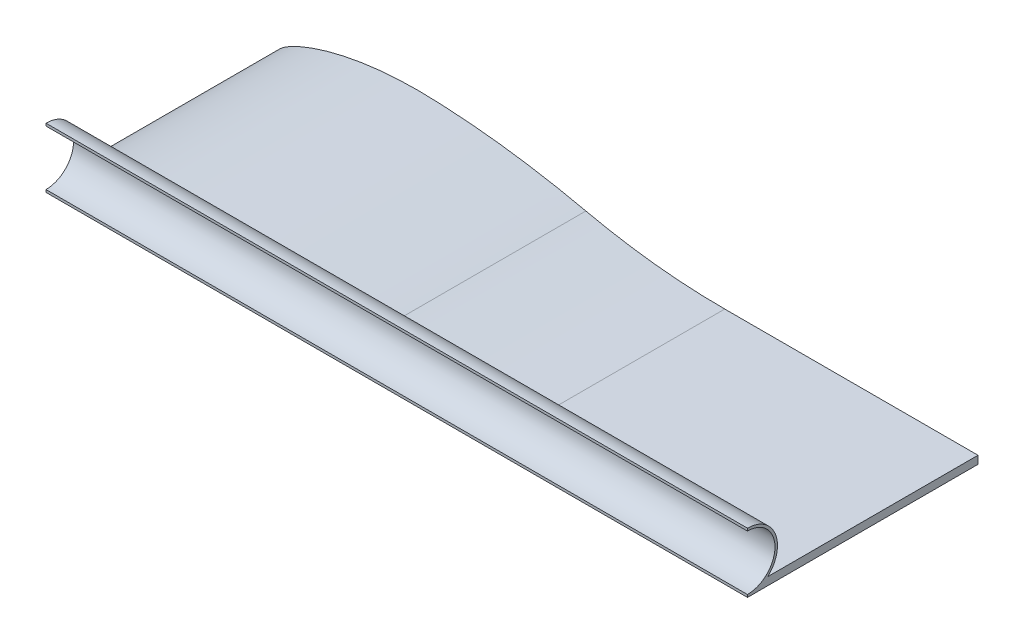
ISO-10303-21;
HEADER;
FILE_DESCRIPTION(('STEP AP214'),'2;1');
FILE_NAME('part.step','',(''),(''),'','','');
FILE_SCHEMA(('AUTOMOTIVE_DESIGN { 1 0 10303 214 1 1 1 1 }'));
ENDSEC;
DATA;
#1=APPLICATION_CONTEXT('core data for automotive mechanical design processes');
#2=APPLICATION_PROTOCOL_DEFINITION('international standard','automotive_design',2000,#1);
#3=PRODUCT_CONTEXT('',#1,'mechanical');
#4=PRODUCT('Part','Part','',(#3));
#5=PRODUCT_RELATED_PRODUCT_CATEGORY('part','',(#4));
#6=PRODUCT_DEFINITION_FORMATION('','',#4);
#7=PRODUCT_DEFINITION_CONTEXT('part definition',#1,'design');
#8=PRODUCT_DEFINITION('design','',#6,#7);
#9=PRODUCT_DEFINITION_SHAPE('','',#8);
#10=(LENGTH_UNIT() NAMED_UNIT(*) SI_UNIT(.MILLI.,.METRE.));
#11=(NAMED_UNIT(*) PLANE_ANGLE_UNIT() SI_UNIT($,.RADIAN.));
#12=(NAMED_UNIT(*) SI_UNIT($,.STERADIAN.) SOLID_ANGLE_UNIT());
#13=UNCERTAINTY_MEASURE_WITH_UNIT(LENGTH_MEASURE(1.E-05),#10,'distance_accuracy_value','');
#14=(GEOMETRIC_REPRESENTATION_CONTEXT(3) GLOBAL_UNCERTAINTY_ASSIGNED_CONTEXT((#13)) GLOBAL_UNIT_ASSIGNED_CONTEXT((#10,
#11,#12)) REPRESENTATION_CONTEXT('',''));
#15=CARTESIAN_POINT('',(0.,0.,0.));
#16=DIRECTION('',(0.,0.,1.));
#17=DIRECTION('',(1.,0.,0.));
#18=AXIS2_PLACEMENT_3D('',#15,#16,#17);
#19=CARTESIAN_POINT('',(0.,0.,185.42));
#20=DIRECTION('',(0.,0.,1.));
#21=DIRECTION('',(1.,0.,0.));
#22=AXIS2_PLACEMENT_3D('',#19,#20,#21);
#23=PLANE('',#22);
#24=DIRECTION('',(-1.,0.,0.));
#25=VECTOR('',#24,1.);
#26=CARTESIAN_POINT('',(563.88,42.5733533691905,185.42));
#27=LINE('',#26,#25);
#28=CARTESIAN_POINT('',(563.88,42.5733533691905,185.42));
#29=VERTEX_POINT('',#28);
#30=CARTESIAN_POINT('',(-0.366692026212409,42.5733533691905,185.42));
#31=VERTEX_POINT('',#30);
#32=EDGE_CURVE('E52',#29,#31,#27,.T.);
#33=ORIENTED_EDGE('',*,*,#32,.F.);
#34=DIRECTION('',(0.,1.,0.));
#35=VECTOR('',#34,1.);
#36=CARTESIAN_POINT('',(563.88,0.,185.42));
#37=LINE('',#36,#35);
#38=CARTESIAN_POINT('',(563.88,44.6053533691905,185.42));
#39=VERTEX_POINT('',#38);
#40=EDGE_CURVE('E175',#29,#39,#37,.T.);
#41=ORIENTED_EDGE('',*,*,#40,.T.);
#42=DIRECTION('',(-1.,0.,0.));
#43=VECTOR('',#42,1.);
#44=CARTESIAN_POINT('',(563.88,44.6053533691905,185.42));
#45=LINE('',#44,#43);
#46=CARTESIAN_POINT('',(-0.366692026212367,44.6053533691905,185.42));
#47=VERTEX_POINT('',#46);
#48=EDGE_CURVE('E211',#39,#47,#45,.T.);
#49=ORIENTED_EDGE('',*,*,#48,.T.);
#50=DIRECTION('',(0.,1.,0.));
#51=VECTOR('',#50,1.);
#52=CARTESIAN_POINT('',(-0.366692026212367,0.,185.42));
#53=LINE('',#52,#51);
#54=EDGE_CURVE('E222',#31,#47,#53,.T.);
#55=ORIENTED_EDGE('',*,*,#54,.F.);
#56=EDGE_LOOP('',(#33,#41,#49,#55));
#57=FACE_BOUND('',#56,.T.);
#58=ADVANCED_FACE('F36',(#57),#23,.T.);
#59=CARTESIAN_POINT('',(0.,2.69535336919036,185.42));
#60=DIRECTION('',(0.,-1.,0.));
#61=DIRECTION('',(1.,0.,0.));
#62=AXIS2_PLACEMENT_3D('',#59,#60,#61);
#63=PLANE('',#62);
#64=DIRECTION('',(-1.,0.,0.));
#65=VECTOR('',#64,1.);
#66=CARTESIAN_POINT('',(563.88,2.69535336919068,169.106554625095));
#67=LINE('',#66,#65);
#68=CARTESIAN_POINT('',(563.88,2.69535336919068,169.106554625095));
#69=VERTEX_POINT('',#68);
#70=CARTESIAN_POINT('',(360.180421151928,2.69535336919056,169.106554625095));
#71=VERTEX_POINT('',#70);
#72=EDGE_CURVE('E60',#69,#71,#67,.T.);
#73=ORIENTED_EDGE('',*,*,#72,.F.);
#74=DIRECTION('',(0.,0.,-1.));
#75=VECTOR('',#74,1.);
#76=CARTESIAN_POINT('',(563.88,2.69535336919067,185.42));
#77=LINE('',#76,#75);
#78=CARTESIAN_POINT('',(563.88,2.69535336919067,0.));
#79=VERTEX_POINT('',#78);
#80=EDGE_CURVE('E121',#69,#79,#77,.T.);
#81=ORIENTED_EDGE('',*,*,#80,.T.);
#82=DIRECTION('',(-1.,0.,0.));
#83=VECTOR('',#82,1.);
#84=CARTESIAN_POINT('',(0.,2.69535336919036,0.));
#85=LINE('',#84,#83);
#86=CARTESIAN_POINT('',(360.180421151928,2.69535336919056,0.));
#87=VERTEX_POINT('',#86);
#88=EDGE_CURVE('E113',#79,#87,#85,.T.);
#89=ORIENTED_EDGE('',*,*,#88,.T.);
#90=DIRECTION('',(0.,0.,1.));
#91=VECTOR('',#90,1.);
#92=CARTESIAN_POINT('',(360.180421151928,2.69535336919056,185.42));
#93=LINE('',#92,#91);
#94=EDGE_CURVE('E118',#87,#71,#93,.T.);
#95=ORIENTED_EDGE('',*,*,#94,.T.);
#96=EDGE_LOOP('',(#73,#81,#89,#95));
#97=FACE_BOUND('',#96,.T.);
#98=ADVANCED_FACE('F120',(#97),#63,.F.);
#99=CARTESIAN_POINT('',(304.8,0.,185.42));
#100=CARTESIAN_POINT('',(304.806765113415,0.0297936907438,185.42));
#101=CARTESIAN_POINT('',(303.042265442166,0.505757681104882,185.42));
#102=CARTESIAN_POINT('',(301.260699107524,1.13128828679422,185.42));
#103=CARTESIAN_POINT('',(296.859481645383,2.43138214292342,185.42));
#104=CARTESIAN_POINT('',(291.428347563501,4.05950750692163,185.42));
#105=CARTESIAN_POINT('',(284.271481229636,6.10623828707882,185.42));
#106=CARTESIAN_POINT('',(275.759062516084,8.44101190552645,185.42));
#107=CARTESIAN_POINT('',(265.867595029522,11.0139121726236,185.42));
#108=CARTESIAN_POINT('',(254.72828410266,13.7239516275996,185.42));
#109=CARTESIAN_POINT('',(242.45219776627,16.501342019607,185.42));
#110=CARTESIAN_POINT('',(229.161916522714,19.2494538440017,185.42));
#111=CARTESIAN_POINT('',(215.002240334106,21.8918598082205,185.42));
#112=CARTESIAN_POINT('',(200.122077246214,24.3476644337164,185.42));
#113=CARTESIAN_POINT('',(184.681833301631,26.5449418917091,185.42));
#114=CARTESIAN_POINT('',(168.851714947921,28.4233907056108,185.42));
#115=CARTESIAN_POINT('',(152.808183208541,29.930661937332,185.42));
#116=CARTESIAN_POINT('',(136.726583628561,31.0048710051825,185.42));
#117=CARTESIAN_POINT('',(120.705050439528,31.6889083800929,185.42));
#118=CARTESIAN_POINT('',(104.91367571592,31.6961733177902,185.42));
#119=CARTESIAN_POINT('',(89.5648924045714,30.8862286831657,185.42));
#120=CARTESIAN_POINT('',(74.9378034426248,29.3709102924395,185.42));
#121=CARTESIAN_POINT('',(61.2207309550213,27.2233169079844,185.42));
#122=CARTESIAN_POINT('',(48.5867513337238,24.5540455106148,185.42));
#123=CARTESIAN_POINT('',(37.1861333906392,21.5011014723962,185.42));
#124=CARTESIAN_POINT('',(27.1552746614983,18.1970778873359,185.42));
#125=CARTESIAN_POINT('',(18.5969283006425,14.8044671458805,185.42));
#126=CARTESIAN_POINT('',(11.6063717286755,11.4360388322654,185.42));
#127=CARTESIAN_POINT('',(6.20537461581932,8.26316028915888,185.42));
#128=CARTESIAN_POINT('',(2.4620711553724,5.3102193566351,185.42));
#129=CARTESIAN_POINT('',(0.172825892274397,2.71807809904705,185.42));
#130=CARTESIAN_POINT('',(-0.366692026212387,-0.106725709936372,185.42));
#131=CARTESIAN_POINT('',(1.61853864418734,-2.17519153343636,185.42));
#132=CARTESIAN_POINT('',(4.90312913802598,-3.1117877974165,185.42));
#133=CARTESIAN_POINT('',(9.54050066961738,-3.65904451106276,185.42));
#134=CARTESIAN_POINT('',(15.6223250235567,-3.68468011379504,185.42));
#135=CARTESIAN_POINT('',(23.0877165309997,-3.30949507157914,185.42));
#136=CARTESIAN_POINT('',(31.8617424793389,-2.56072504363965,185.42));
#137=CARTESIAN_POINT('',(41.8437098749915,-1.53618962834286,185.42));
#138=CARTESIAN_POINT('',(52.9319861205823,-0.324549042889645,185.42));
#139=CARTESIAN_POINT('',(65.0085126482625,0.982737612858198,185.42));
#140=CARTESIAN_POINT('',(77.9641225568185,2.27751163277432,185.42));
#141=CARTESIAN_POINT('',(91.6740314858693,3.44660128053989,185.42));
#142=CARTESIAN_POINT('',(106.020407657375,4.41212483885966,185.42));
#143=CARTESIAN_POINT('',(120.95534562256,5.05177624345621,185.42));
#144=CARTESIAN_POINT('',(136.33914130998,5.41029723383236,185.42));
#145=CARTESIAN_POINT('',(152.007716340095,5.72933017095042,185.42));
#146=CARTESIAN_POINT('',(167.715786189237,5.89135553497832,185.42));
#147=CARTESIAN_POINT('',(183.286749282816,5.90781947795733,185.42));
#148=CARTESIAN_POINT('',(198.553027184666,5.75950083301546,185.42));
#149=CARTESIAN_POINT('',(213.347799024157,5.45737661505621,185.42));
#150=CARTESIAN_POINT('',(227.508384673819,5.01338248731081,185.42));
#151=CARTESIAN_POINT('',(240.877077650288,4.45854649480439,185.42));
#152=CARTESIAN_POINT('',(253.302348041566,3.81956254234677,185.42));
#153=CARTESIAN_POINT('',(264.636493620716,3.14064435260617,185.42));
#154=CARTESIAN_POINT('',(274.759317931257,2.45167335072776,185.42));
#155=CARTESIAN_POINT('',(283.511762664263,1.80333800911344,185.42));
#156=CARTESIAN_POINT('',(290.902443864489,1.20739442477992,185.42));
#157=CARTESIAN_POINT('',(296.536660630331,0.742433739926797,185.42));
#158=CARTESIAN_POINT('',(301.097723541562,0.310240549260641,185.42));
#159=CARTESIAN_POINT('',(302.984341567181,0.206591885939164,185.42));
#160=CARTESIAN_POINT('',(304.793276654245,-0.0296097451566188,185.42));
#161=CARTESIAN_POINT('',(304.8,0.,185.42));
#162=B_SPLINE_CURVE_WITH_KNOTS('',3,(#99,#100,#101,#102,#103,#104,#105,#106,#107,#108,#109,#110,
#111,#112,#113,#114,#115,#116,#117,#118,#119,#120,#121,#122,#123,#124,#125,#126,#127,#128,#129,
#130,#131,#132,#133,#134,#135,#136,#137,#138,#139,#140,#141,#142,#143,#144,#145,#146,#147,#148,
#149,#150,#151,#152,#153,#154,#155,#156,#157,#158,#159,#160,#161),.UNSPECIFIED.,.T.,.F.,(4,1,1,
1,1,1,1,1,1,1,1,1,1,1,1,1,1,1,1,1,1,1,1,1,1,1,1,1,1,1,1,1,1,1,1,1,1,1,1,1,1,1,1,1,1,1,1,1,1,1,1,
1,1,1,1,1,1,1,1,1,4),(0.,0.00137455348322331,0.00548449728179396,0.0122733609908927,
0.021682195504866,0.0335806119079948,0.0478307427867091,0.0643059527211734,0.082777332043007,
0.103063756455997,0.124929016786915,0.148149110667858,0.172444694611559,0.197572105868171,
0.223268880537162,0.249227774933554,0.275186209349679,0.300900708934774,0.326462938278696,
0.351222485186767,0.374905858971967,0.397269706218861,0.418072413969665,0.437079533175026,
0.454093093767394,0.468919631578705,0.48139171235289,0.491447126518173,0.499023571234557,
0.504293734329401,0.507921918342,0.511539686153778,0.516780527527172,0.524216490268905,
0.533991629403711,0.546033957270731,0.560220284382465,0.576403357410148,0.594370816485922,
0.613951103581465,0.634916884969972,0.657088503485648,0.680229909573905,0.704175481107386,
0.72909036740664,0.754353775526935,0.779667752347888,0.804760119952374,0.829359338708984,
0.853208710008459,0.876041363199166,0.897604065496152,0.917662212410958,0.935969860405553,
0.952309787739252,0.966502759006892,0.978350082728452,0.987731492337842,0.994510920242662,
0.998633932979557,1.),.UNSPECIFIED.);
#163=DIRECTION('',(0.,0.,-1.));
#164=VECTOR('',#163,1.);
#165=SURFACE_OF_LINEAR_EXTRUSION('',#162,#164);
#166=CARTESIAN_POINT('',(248.468052168918,15.1306788652424,161.889352868082));
#167=CARTESIAN_POINT('',(247.164925425588,15.4244599020673,161.822640183714));
#168=CARTESIAN_POINT('',(245.860667643667,15.7146705661414,161.762492399588));
#169=CARTESIAN_POINT('',(243.250371487808,16.2877798033205,161.654345455011));
#170=CARTESIAN_POINT('',(241.944333617626,16.570680118452,161.606343375866));
#171=CARTESIAN_POINT('',(239.330538940863,17.1290944674202,161.52148225599));
#172=CARTESIAN_POINT('',(238.022782439655,17.4046096652577,161.484621449711));
#173=CARTESIAN_POINT('',(235.405630746313,17.948315130686,161.421127358427));
#174=CARTESIAN_POINT('',(234.096235720714,18.2165060880256,161.394493107248));
#175=CARTESIAN_POINT('',(231.475881403625,18.7455977285112,161.350614786289));
#176=CARTESIAN_POINT('',(230.164922187072,19.0064987473441,161.333370283452));
#177=CARTESIAN_POINT('',(227.541510589522,19.5210404418597,161.307502556103));
#178=CARTESIAN_POINT('',(226.229058224272,19.7746811933824,161.298879241502));
#179=CARTESIAN_POINT('',(223.590572588544,20.2769467022491,161.289496302739));
#180=CARTESIAN_POINT('',(222.264526087185,20.5255032726702,161.288810227296));
#181=CARTESIAN_POINT('',(219.611009151825,21.0150974013907,161.294795117233));
#182=CARTESIAN_POINT('',(218.283538663402,21.2561346608944,161.301466374591));
#183=CARTESIAN_POINT('',(215.627225028148,21.7306291851339,161.321502698001));
#184=CARTESIAN_POINT('',(214.298381814655,21.9640860619945,161.334868106008));
#185=CARTESIAN_POINT('',(211.639376243386,22.4233652891199,161.367658066768));
#186=CARTESIAN_POINT('',(210.3092138161,22.6491872123968,161.38708295778));
#187=CARTESIAN_POINT('',(207.647621966798,23.0931465145668,161.431381135887));
#188=CARTESIAN_POINT('',(206.316192479227,23.3112834708545,161.45625472207));
#189=CARTESIAN_POINT('',(203.652127765779,23.739821592645,161.510864225378));
#190=CARTESIAN_POINT('',(202.319492483819,23.9502223771345,161.540600381595));
#191=CARTESIAN_POINT('',(196.819782154879,24.802095885517,161.672094883058));
#192=CARTESIAN_POINT('',(192.647776198739,25.4094117409485,161.792612052374));
#193=CARTESIAN_POINT('',(186.382451644462,26.2623772054258,161.992402373168));
#194=CARTESIAN_POINT('',(184.292700181345,26.5370416142408,162.062171675134));
#195=CARTESIAN_POINT('',(180.110865849614,27.0668362085987,162.206110925706));
#196=CARTESIAN_POINT('',(178.018782986637,27.3219664412764,162.280280863694));
#197=CARTESIAN_POINT('',(173.832091101025,27.8124298675252,162.431088654011));
#198=CARTESIAN_POINT('',(171.737481764,28.0477602667632,162.507726852581));
#199=CARTESIAN_POINT('',(167.546120948388,28.4983443350209,162.661591463411));
#200=CARTESIAN_POINT('',(165.449369465409,28.7135979627945,162.73881787688));
#201=CARTESIAN_POINT('',(161.253324170782,29.1233268268422,162.891855210023));
#202=CARTESIAN_POINT('',(159.154029910841,29.3177976034176,162.967665823017));
#203=CARTESIAN_POINT('',(156.003591619498,29.5932868090229,163.078782742897));
#204=CARTESIAN_POINT('',(154.953197336474,29.6824136176625,163.115388506002));
#205=CARTESIAN_POINT('',(152.851914836119,29.8551427620257,163.187473952133));
#206=CARTESIAN_POINT('',(151.801026618781,29.938745097668,163.222953635143));
#207=CARTESIAN_POINT('',(149.698429626554,30.1004946870226,163.292611725018));
#208=CARTESIAN_POINT('',(148.646720694329,30.1786400851256,163.326789687459));
#209=CARTESIAN_POINT('',(146.542872545466,30.3295725009163,163.393695752367));
#210=CARTESIAN_POINT('',(145.490733328904,30.4023595195739,163.426423855094));
#211=CARTESIAN_POINT('',(143.386044476681,30.5426838406563,163.490300959052));
#212=CARTESIAN_POINT('',(142.333494836226,30.6102210798147,163.521449941251));
#213=CARTESIAN_POINT('',(140.228028333244,30.7401568252862,163.582054813722));
#214=CARTESIAN_POINT('',(139.175111470367,30.8025553267082,163.611510702384));
#215=CARTESIAN_POINT('',(137.59520504619,30.892402192906,163.65435978933));
#216=CARTESIAN_POINT('',(137.068340026547,30.9217333453352,163.668423944486));
#217=CARTESIAN_POINT('',(136.014529847769,30.9791467370252,163.696090585411));
#218=CARTESIAN_POINT('',(135.487584688634,31.0072289762966,163.709693071184));
#219=CARTESIAN_POINT('',(133.906624093914,31.0894528307714,163.749709141554));
#220=CARTESIAN_POINT('',(132.852482133561,31.1415716630642,163.775331377657));
#221=CARTESIAN_POINT('',(130.743855405448,31.2396580700171,163.823943788298));
#222=CARTESIAN_POINT('',(129.689370639524,31.285625677111,163.846933976715));
#223=CARTESIAN_POINT('',(127.580056421676,31.3706445245525,163.889746954508));
#224=CARTESIAN_POINT('',(126.525226969818,31.4096957662246,163.909569744491));
#225=CARTESIAN_POINT('',(124.418696900439,31.4800110535864,163.945457586213));
#226=CARTESIAN_POINT('',(123.366997339442,31.5113001630597,163.961534722088));
#227=CARTESIAN_POINT('',(121.263330618907,31.5654721705466,163.989482761648));
#228=CARTESIAN_POINT('',(120.211363459522,31.5883550733668,164.001353667738));
#229=CARTESIAN_POINT('',(117.055150767101,31.643461313098,164.029997633645));
#230=CARTESIAN_POINT('',(114.950564613294,31.6621431998202,164.039802467901));
#231=CARTESIAN_POINT('',(111.793998324511,31.6601651237236,164.038775033159));
#232=CARTESIAN_POINT('',(110.741981340093,31.6545079624804,164.035811338563));
#233=CARTESIAN_POINT('',(108.638080668531,31.6327097899939,164.024428543781));
#234=CARTESIAN_POINT('',(107.586196981162,31.6165687965691,164.016009452866));
#235=CARTESIAN_POINT('',(105.482715806842,31.5732638595659,163.99352383926));
#236=CARTESIAN_POINT('',(104.431118319521,31.5460999302514,163.979457323877));
#237=CARTESIAN_POINT('',(102.328371993498,31.4804845389144,163.945705819111));
#238=CARTESIAN_POINT('',(101.277223155203,31.4420330666285,163.92602082462));
#239=CARTESIAN_POINT('',(98.1263949923281,31.3099614304449,163.858966041753));
#240=CARTESIAN_POINT('',(96.027548558764,31.1995872698837,163.803576678182));
#241=CARTESIAN_POINT('',(92.8818774999196,31.0007119330988,163.706432085101));
#242=CARTESIAN_POINT('',(91.8337372584327,30.9288664250582,163.671706478463));
#243=CARTESIAN_POINT('',(89.7384142221902,30.7741360954736,163.598007548471));
#244=CARTESIAN_POINT('',(88.6912314276098,30.6912512719087,163.559034224339));
#245=CARTESIAN_POINT('',(86.5989869390888,30.5144468625416,163.477279588844));
#246=CARTESIAN_POINT('',(85.5539241718999,30.42053822011,163.43450206398));
#247=CARTESIAN_POINT('',(83.4650273575734,30.2214188035254,163.345513117531));
#248=CARTESIAN_POINT('',(82.4211933098147,30.1162080350876,163.299301697683));
#249=CARTESIAN_POINT('',(79.2917567496344,29.7833568846627,163.156205684741));
#250=CARTESIAN_POINT('',(77.2081597776193,29.5384926062078,163.054856941514));
#251=CARTESIAN_POINT('',(73.0500242910226,29.0017171934326,162.84477165033));
#252=CARTESIAN_POINT('',(70.9754778067964,28.7098640557306,162.736044304004));
#253=CARTESIAN_POINT('',(66.8339116013979,28.0772498234034,162.516284019623));
#254=CARTESIAN_POINT('',(64.7668920427252,27.7364876792197,162.405251032134));
#255=CARTESIAN_POINT('',(60.6441150825648,27.0049032926658,162.187104395432));
#256=CARTESIAN_POINT('',(58.588347045288,26.6141424061649,162.079986145996));
#257=CARTESIAN_POINT('',(54.486989784021,25.7802239542613,161.876431925602));
#258=CARTESIAN_POINT('',(52.4413999364102,25.3370696412616,161.779995292285));
#259=CARTESIAN_POINT('',(49.6366710572766,24.6901833252646,161.660282198348));
#260=CARTESIAN_POINT('',(48.8724223131014,24.5098857440671,161.628946099535));
#261=CARTESIAN_POINT('',(47.3456910665276,24.1415006362886,161.569400559599));
#262=CARTESIAN_POINT('',(46.5832085418963,23.9534132083329,161.541191078906));
#263=CARTESIAN_POINT('',(44.2984421761596,23.3770471852104,161.46195976695));
#264=CARTESIAN_POINT('',(42.7789893010472,22.9766992948006,161.416341643092));
#265=CARTESIAN_POINT('',(39.7482676373995,22.1417221169884,161.343956251836));
#266=CARTESIAN_POINT('',(38.23700297897,21.7070769895704,161.317197751999));
#267=CARTESIAN_POINT('',(35.9772640369537,21.0279285010015,161.295265620504));
#268=CARTESIAN_POINT('',(35.2248122333826,20.7968853451199,161.290991759705));
#269=CARTESIAN_POINT('',(33.7228207663359,20.325472646359,161.289313506002));
#270=CARTESIAN_POINT('',(32.9732810961157,20.0851031250942,161.291909097179));
#271=CARTESIAN_POINT('',(31.4835646463681,19.59674760321,161.304774177852));
#272=CARTESIAN_POINT('',(30.7433615223291,19.3488403466687,161.314980482421));
#273=CARTESIAN_POINT('',(29.2664467355889,18.8432673729247,161.343926426474));
#274=CARTESIAN_POINT('',(28.5297350934168,18.5856015984241,161.362666116069));
#275=CARTESIAN_POINT('',(27.4276342175527,18.1916161499483,161.397951520169));
#276=CARTESIAN_POINT('',(27.0607836159544,18.0590480493632,161.410908307019));
#277=CARTESIAN_POINT('',(26.3281068625754,17.7913780467485,161.4393559428));
#278=CARTESIAN_POINT('',(25.9622807108012,17.656276144703,161.454846791746));
#279=CARTESIAN_POINT('',(24.8664780781272,17.2469943856492,161.505355031272));
#280=CARTESIAN_POINT('',(24.1381617863274,16.9688328976335,161.544408601834));
#281=CARTESIAN_POINT('',(22.6877214643766,16.4013971725796,161.634664281177));
#282=CARTESIAN_POINT('',(21.9655905984179,16.1121378982855,161.685850483172));
#283=CARTESIAN_POINT('',(20.5274332217204,15.5213427176331,161.802096790625));
#284=CARTESIAN_POINT('',(19.8114069032373,15.2198064263388,161.867157331374));
#285=CARTESIAN_POINT('',(18.7431928435049,14.7579680611225,161.976592401743));
#286=CARTESIAN_POINT('',(18.3882864530185,14.6025212723613,162.015020358452));
#287=CARTESIAN_POINT('',(17.6804290393015,14.288317428148,162.09611080321));
#288=CARTESIAN_POINT('',(17.3274780173278,14.1295603705684,162.138773293979));
#289=CARTESIAN_POINT('',(16.2719192431203,13.648136968478,162.273569811039));
#290=CARTESIAN_POINT('',(15.5725154387058,13.3202794408183,162.372521974064));
#291=CARTESIAN_POINT('',(14.2952000113859,12.7034780334824,162.573938259469));
#292=CARTESIAN_POINT('',(13.7157562175605,12.4167023101796,162.673306660181));
#293=CARTESIAN_POINT('',(12.8530205806016,11.9784766015881,162.834956233863));
#294=CARTESIAN_POINT('',(12.566496058585,11.8310482411381,162.890942801393));
#295=CARTESIAN_POINT('',(11.9957725544127,11.5334698186693,163.007388696408));
#296=CARTESIAN_POINT('',(11.7115735923192,11.3833197332067,163.067848062435));
#297=CARTESIAN_POINT('',(11.1447971141717,11.0798640840269,163.19369192993));
#298=CARTESIAN_POINT('',(10.8622272054984,10.9265502807272,163.259090915355));
#299=CARTESIAN_POINT('',(10.3000141938442,10.6169080242397,163.395093394048));
#300=CARTESIAN_POINT('',(10.0203711031575,10.4605795583966,163.465696909169));
#301=CARTESIAN_POINT('',(9.18660213336724,9.98646021613457,163.686113293252));
#302=CARTESIAN_POINT('',(8.63758860489295,9.66350993895981,163.844542439053));
#303=CARTESIAN_POINT('',(7.73352324581845,9.10933139853149,164.133064104646));
#304=CARTESIAN_POINT('',(7.37342457712074,8.88240594528531,164.255631417945));
#305=CARTESIAN_POINT('',(6.66328414473977,8.42096677424286,164.51500688256));
#306=CARTESIAN_POINT('',(6.31324288623375,8.18645267652746,164.651815747629));
#307=CARTESIAN_POINT('',(5.62488156916329,7.70983314736078,164.941322642274));
#308=CARTESIAN_POINT('',(5.2865648235004,7.46772560651706,165.094025114764));
#309=CARTESIAN_POINT('',(4.62585239453439,6.97650014599339,165.416902652761));
#310=CARTESIAN_POINT('',(4.30340129478776,6.72741223042435,165.587009394031));
#311=CARTESIAN_POINT('',(3.6761973289816,6.2216315028982,165.947336190953));
#312=CARTESIAN_POINT('',(3.37143967063131,5.96494077888535,166.137550760629));
#313=CARTESIAN_POINT('',(2.92990669767629,5.57519748739809,166.439240903969));
#314=CARTESIAN_POINT('',(2.78535982966191,5.44452790250731,166.542507719079));
#315=CARTESIAN_POINT('',(2.50178563290083,5.1818180319451,166.754706797743));
#316=CARTESIAN_POINT('',(2.36275784638277,5.04977786110555,166.863638589684));
#317=CARTESIAN_POINT('',(2.11967587786687,4.81310271807867,167.063273897613));
#318=CARTESIAN_POINT('',(2.01451911365315,4.70866755740986,167.152872450875));
#319=CARTESIAN_POINT('',(1.80896096358699,4.49878319143545,167.336153708045));
#320=CARTESIAN_POINT('',(1.70855777116779,4.39333438998808,167.429834833975));
#321=CARTESIAN_POINT('',(1.51371893208234,4.1811323678319,167.62180553999));
#322=CARTESIAN_POINT('',(1.41928257488994,4.07437930424713,167.720094568933));
#323=CARTESIAN_POINT('',(1.23766327887107,3.85973765482911,167.921433881009));
#324=CARTESIAN_POINT('',(1.15046609174755,3.75185179418133,168.024474159063));
#325=CARTESIAN_POINT('',(0.984054683656281,3.53489040416352,168.235689354256));
#326=CARTESIAN_POINT('',(0.904841741320136,3.42581468733459,168.343865089743));
#327=CARTESIAN_POINT('',(0.755142291484847,3.20687076402363,168.565307998059));
#328=CARTESIAN_POINT('',(0.68465461526952,3.09700266576895,168.678574486226));
#329=CARTESIAN_POINT('',(0.552197490881949,2.87593917913356,168.911108745487));
#330=CARTESIAN_POINT('',(0.490313668541019,2.76474097212778,169.030422654713));
#331=CARTESIAN_POINT('',(0.37595661706178,2.54261571219393,169.273763279502));
#332=CARTESIAN_POINT('',(0.323485282437755,2.43168871827658,169.397790937759));
#333=CARTESIAN_POINT('',(0.227715064793229,2.21073874525688,169.650127405005));
#334=CARTESIAN_POINT('',(0.184416873621201,2.1007158349426,169.778436536063));
#335=CARTESIAN_POINT('',(0.106822728176045,1.88201873384959,170.039045292637));
#336=CARTESIAN_POINT('',(0.0725337347147431,1.77334564738967,170.171347916188));
#337=CARTESIAN_POINT('',(0.0131321781258083,1.55788369249959,170.43948536912));
#338=CARTESIAN_POINT('',(-0.0119811059093679,1.45109467667141,170.57531992011));
#339=CARTESIAN_POINT('',(-0.0527980234667192,1.23977438083634,170.850186702737));
#340=CARTESIAN_POINT('',(-0.0684992042464718,1.13524369617321,170.989219758093));
#341=CARTESIAN_POINT('',(-0.0897230222668906,0.932627377024537,171.264896819139));
#342=CARTESIAN_POINT('',(-0.0955959483818034,0.834445718634856,171.401443064576));
#343=CARTESIAN_POINT('',(-0.0978413079863748,0.640944601001934,171.676586658786));
#344=CARTESIAN_POINT('',(-0.0942158668283575,0.54562450628338,171.815183541809));
#345=CARTESIAN_POINT('',(-0.0769527238791082,0.358228912095548,172.093846568611));
#346=CARTESIAN_POINT('',(-0.0633211676257515,0.266151457428234,172.233911758562));
#347=CARTESIAN_POINT('',(-0.0349154824857187,0.130689193799868,172.44469523828));
#348=CARTESIAN_POINT('',(-0.0241139034201461,0.0859579799151414,172.515102379692));
#349=CARTESIAN_POINT('',(0.000261522494881706,-0.00256073837170566,172.656032929992));
#350=CARTESIAN_POINT('',(0.0138353384431742,-0.0463482532868974,172.726556337576));
#351=CARTESIAN_POINT('',(0.043665791146454,-0.132959559290341,172.867661776342));
#352=CARTESIAN_POINT('',(0.0599234060238318,-0.175782992524609,172.938243819528));
#353=CARTESIAN_POINT('',(0.0949324637473871,-0.260433987084305,173.07938431231));
#354=CARTESIAN_POINT('',(0.113683960447384,-0.302261526881033,173.149942761365));
#355=CARTESIAN_POINT('',(0.173451504151184,-0.426251059823478,173.361535829066));
#356=CARTESIAN_POINT('',(0.217977207337255,-0.506910308727884,173.502472419666));
#357=CARTESIAN_POINT('',(0.314176364400845,-0.662559729252435,173.780823245847));
#358=CARTESIAN_POINT('',(0.365682168854001,-0.737632847288733,173.918249846215));
#359=CARTESIAN_POINT('',(0.475570224969881,-0.88398953253523,174.192377231261));
#360=CARTESIAN_POINT('',(0.533953092199053,-0.955272759681892,174.329077949819));
#361=CARTESIAN_POINT('',(0.65681790304954,-1.09416180590912,174.601667205639));
#362=CARTESIAN_POINT('',(0.721302157186077,-1.16176621648216,174.737555414335));
#363=CARTESIAN_POINT('',(0.85572801573889,-1.29338548867983,175.008392040471));
#364=CARTESIAN_POINT('',(0.925670492101672,-1.35739977396614,175.143340303989));
#365=CARTESIAN_POINT('',(1.07060106078702,-1.48197901940275,175.412281245175));
#366=CARTESIAN_POINT('',(1.14559336869878,-1.54254101773279,175.54627301854));
#367=CARTESIAN_POINT('',(1.30024626420875,-1.6602188113226,175.812993163573));
#368=CARTESIAN_POINT('',(1.37990512720689,-1.71733586407548,175.945721981169));
#369=CARTESIAN_POINT('',(1.54387226368795,-1.82817710353125,176.209684582557));
#370=CARTESIAN_POINT('',(1.62817976377231,-1.88190185144401,176.340918610683));
#371=CARTESIAN_POINT('',(1.80170690076476,-1.98596184409206,176.601502104383));
#372=CARTESIAN_POINT('',(1.89092714984386,-2.0362966646679,176.730851332543));
#373=CARTESIAN_POINT('',(2.06369671098065,-2.12787601641883,176.972185334576));
#374=CARTESIAN_POINT('',(2.14668599157468,-2.16949468934893,177.084429224286));
#375=CARTESIAN_POINT('',(2.31671947241724,-2.25010351113672,177.306770522982));
#376=CARTESIAN_POINT('',(2.40376362293862,-2.28909369221475,177.416867958268));
#377=CARTESIAN_POINT('',(2.58191788199487,-2.36446569899569,177.63457571818));
#378=CARTESIAN_POINT('',(2.67302663535202,-2.40084838367278,177.742186853866));
#379=CARTESIAN_POINT('',(2.85924256139354,-2.47105663230064,177.954634747532));
#380=CARTESIAN_POINT('',(2.95434739941094,-2.50488365790937,178.059473068722));
#381=CARTESIAN_POINT('',(3.14841593008799,-2.57008370863043,178.266226287194));
#382=CARTESIAN_POINT('',(3.24737824207153,-2.60145759990544,178.368142208206));
#383=CARTESIAN_POINT('',(3.44890942697219,-2.66190701576188,178.569080771201));
#384=CARTESIAN_POINT('',(3.55147897221949,-2.69098210856895,178.668102867456));
#385=CARTESIAN_POINT('',(3.7597804560281,-2.74703361461058,178.863477677338));
#386=CARTESIAN_POINT('',(3.86551396435634,-2.77400896135115,178.959829018655));
#387=CARTESIAN_POINT('',(4.02594430243258,-2.81308066852158,179.102708268571));
#388=CARTESIAN_POINT('',(4.07973648571333,-2.8258749833631,179.150068897359));
#389=CARTESIAN_POINT('',(4.1878167698063,-2.85103662298783,179.244337203673));
#390=CARTESIAN_POINT('',(4.24210487650024,-2.86340394269848,179.291244875815));
#391=CARTESIAN_POINT('',(4.34813062548616,-2.88709663776906,179.382209120654));
#392=CARTESIAN_POINT('',(4.39984855518583,-2.89844229132473,179.426283448549));
#393=CARTESIAN_POINT('',(4.50349904989671,-2.92082513235922,179.514257871186));
#394=CARTESIAN_POINT('',(4.55543161589158,-2.93186231842256,179.558157965127));
#395=CARTESIAN_POINT('',(4.71153579595155,-2.96452017201455,179.689608880578));
#396=CARTESIAN_POINT('',(4.81601337717511,-2.98568702033543,179.77690989537));
#397=CARTESIAN_POINT('',(5.02576424240515,-3.0268251140767,179.95076932512));
#398=CARTESIAN_POINT('',(5.13103727911024,-3.04679671515325,180.037327954348));
#399=CARTESIAN_POINT('',(5.3424091306971,-3.08557587082947,180.209691287827));
#400=CARTESIAN_POINT('',(5.44850793757947,-3.10438343668964,180.295495999365));
#401=CARTESIAN_POINT('',(5.76803114458192,-3.15909445285113,180.551707050836));
#402=CARTESIAN_POINT('',(5.98270368909742,-3.19329040072605,180.720928027566));
#403=CARTESIAN_POINT('',(6.41557709542549,-3.25737038848012,181.056072659359));
#404=CARTESIAN_POINT('',(6.63378118255559,-3.28725020682989,181.221992951167));
#405=CARTESIAN_POINT('',(7.07347435572046,-3.34288951879094,181.550129399223));
#406=CARTESIAN_POINT('',(7.29496343716319,-3.36864901816138,181.712345560648));
#407=CARTESIAN_POINT('',(7.74110892808461,-3.4162966592661,182.03293186292));
#408=CARTESIAN_POINT('',(7.96576525017349,-3.43818490759026,182.191302109554));
#409=CARTESIAN_POINT('',(8.32592157523803,-3.47018405384572,182.440589874661));
#410=CARTESIAN_POINT('',(8.46048286907706,-3.48146184270034,182.53271941147));
#411=CARTESIAN_POINT('',(8.730530634206,-3.50281295604515,182.715756195717));
#412=CARTESIAN_POINT('',(8.86601711308918,-3.51288627063726,182.806663433105));
#413=CARTESIAN_POINT('',(9.13774693980499,-3.53189408792276,182.987465152849));
#414=CARTESIAN_POINT('',(9.2739903032508,-3.54082856703227,183.077359614197));
#415=CARTESIAN_POINT('',(9.54721063834234,-3.55759529282994,183.256128569225));
#416=CARTESIAN_POINT('',(9.68418760706567,-3.56542754390555,183.345003066964));
#417=CARTESIAN_POINT('',(10.0960684378811,-3.58731102801047,183.609899684707));
#418=CARTESIAN_POINT('',(10.3720975059389,-3.59976116599344,183.78431168001));
#419=CARTESIAN_POINT('',(10.9271983955848,-3.62067275482336,184.128435752846));
#420=CARTESIAN_POINT('',(11.2062700582825,-3.62913441294554,184.298148074183));
#421=CARTESIAN_POINT('',(11.7546861056215,-3.64206823065373,184.624793175917));
#422=CARTESIAN_POINT('',(12.0238900956852,-3.64670546362667,184.78195517437));
#423=CARTESIAN_POINT('',(12.5652288128136,-3.65290235331285,185.091222550009));
#424=CARTESIAN_POINT('',(12.8373635293303,-3.65446202109879,185.243327945386));
#425=CARTESIAN_POINT('',(13.1276936917631,-3.65464149077088,185.401797585195));
#426=CARTESIAN_POINT('',(13.1444016876987,-3.65464663445431,185.410903945736));
#427=CARTESIAN_POINT('',(13.1611152527334,-3.65464663080947,185.42));
#428=B_SPLINE_CURVE_WITH_KNOTS('',3,(#166,#167,#168,#169,#170,#171,#172,#173,#174,#175,#176,
#177,#178,#179,#180,#181,#182,#183,#184,#185,#186,#187,#188,#189,#190,#191,#192,#193,#194,#195,
#196,#197,#198,#199,#200,#201,#202,#203,#204,#205,#206,#207,#208,#209,#210,#211,#212,#213,#214,
#215,#216,#217,#218,#219,#220,#221,#222,#223,#224,#225,#226,#227,#228,#229,#230,#231,#232,#233,
#234,#235,#236,#237,#238,#239,#240,#241,#242,#243,#244,#245,#246,#247,#248,#249,#250,#251,#252,
#253,#254,#255,#256,#257,#258,#259,#260,#261,#262,#263,#264,#265,#266,#267,#268,#269,#270,#271,
#272,#273,#274,#275,#276,#277,#278,#279,#280,#281,#282,#283,#284,#285,#286,#287,#288,#289,#290,
#291,#292,#293,#294,#295,#296,#297,#298,#299,#300,#301,#302,#303,#304,#305,#306,#307,#308,#309,
#310,#311,#312,#313,#314,#315,#316,#317,#318,#319,#320,#321,#322,#323,#324,#325,#326,#327,#328,
#329,#330,#331,#332,#333,#334,#335,#336,#337,#338,#339,#340,#341,#342,#343,#344,#345,#346,#347,
#348,#349,#350,#351,#352,#353,#354,#355,#356,#357,#358,#359,#360,#361,#362,#363,#364,#365,#366,
#367,#368,#369,#370,#371,#372,#373,#374,#375,#376,#377,#378,#379,#380,#381,#382,#383,#384,#385,
#386,#387,#388,#389,#390,#391,#392,#393,#394,#395,#396,#397,#398,#399,#400,#401,#402,#403,#404,
#405,#406,#407,#408,#409,#410,#411,#412,#413,#414,#415,#416,#417,#418,#419,#420,#421,#422,#423,
#424,#425,#426,#427),.UNSPECIFIED.,.F.,.F.,(4,2,2,2,2,2,2,2,2,2,2,2,2,2,2,2,2,2,2,2,2,2,2,2,2,2,
2,2,2,2,2,2,2,2,2,2,2,2,2,2,2,2,2,2,2,2,2,2,2,2,2,2,2,2,2,2,2,2,2,2,2,2,2,2,2,2,2,2,2,2,2,2,2,2,
2,2,2,2,2,2,2,2,2,2,2,2,2,2,2,2,2,2,2,2,2,2,2,2,2,2,2,2,2,2,2,2,2,2,2,2,2,2,2,2,2,2,2,2,2,2,2,2,
2,2,2,2,2,2,2,2,4),(0.,4.0124543826742,8.02394362775899,12.0347968416616,16.0452710281977,
20.05556023515,24.0658075357071,28.1131854865722,32.1607240642049,36.2084694221288,
40.2564407786785,44.3046343914997,48.3530271150028,61.0050733408155,67.3316445420594,
73.6582004772072,79.9856477812269,86.3131080841941,92.6419234535807,95.8063233252208,
98.9707232434803,102.136194015362,105.301664214364,108.467172555313,111.632683909154,
113.216287135517,114.799890348532,117.967092543808,121.134278038646,124.301462926973,
127.458283877969,130.615103023982,136.928653042254,140.084710295697,143.240762185072,
146.396809990445,149.552860665515,155.859605460856,159.013076186522,162.166547489482,
165.316914393717,168.467279704936,174.767829461791,181.060661472258,187.353628543383,
193.638945973348,199.923873437176,202.281396508474,204.638889740879,209.354337524277,
214.071976006665,216.433309684179,218.794637889439,221.136577366064,223.478530595693,
224.649366694695,225.820202801075,228.161825204312,230.50039438332,232.839036942866,
234.007071042299,235.175105892468,237.510879304434,239.472886954064,240.454013047706,
241.435147596405,242.419279928048,243.403416391877,245.371523595519,246.699981946125,
248.0285069081,249.357404249729,250.681271513566,252.004778517223,252.666239894768,
253.327646293339,253.847112618068,254.366379911388,254.885585253767,255.403743181687,
255.921983958265,256.440155243175,256.963161850731,257.486273609492,258.009424807877,
258.532979029851,259.056492108915,259.580141553373,260.084695768109,260.589137093562,
261.093268861096,261.345560919817,261.59785016648,261.8502315649,262.102618414224,
262.607448367266,263.101793980153,263.596183875628,264.090761745143,264.585418785438,
265.080494010143,265.575387412188,266.07019872529,266.565071836312,267.001973417749,
267.438869642625,267.875621275088,268.312121194948,268.748466291063,269.184893150437,
269.621540250727,269.839946785742,270.058355914464,270.265028323795,270.471701681344,
270.885050457774,271.298275620824,271.711496785842,272.53785494268,273.365015951049,
274.192175803249,275.019312877129,275.509706020063,276.000103192649,276.490510519106,
276.98091589343,277.961093894886,278.941220952364,279.876426517291,280.811628717459,
280.868714131052),.UNSPECIFIED.);
#429=CARTESIAN_POINT('',(248.468052126158,15.1306788748815,161.889352865892));
#430=VERTEX_POINT('',#429);
#431=CARTESIAN_POINT('',(13.1611152527335,-3.65464663080947,185.42));
#432=VERTEX_POINT('',#431);
#433=EDGE_CURVE('E147',#430,#432,#428,.T.);
#434=ORIENTED_EDGE('',*,*,#433,.F.);
#435=DIRECTION('',(0.,0.,-1.));
#436=VECTOR('',#435,1.);
#437=CARTESIAN_POINT('',(248.468052126158,15.1306788748816,185.42));
#438=LINE('',#437,#436);
#439=CARTESIAN_POINT('',(248.468052126158,15.1306788748816,0.));
#440=VERTEX_POINT('',#439);
#441=EDGE_CURVE('E125',#430,#440,#438,.T.);
#442=ORIENTED_EDGE('',*,*,#441,.T.);
#443=CARTESIAN_POINT('',(304.8,0.,0.));
#444=CARTESIAN_POINT('',(304.806765113415,0.0297936907438,0.));
#445=CARTESIAN_POINT('',(303.042265442166,0.505757681104882,0.));
#446=CARTESIAN_POINT('',(301.260699107524,1.13128828679422,0.));
#447=CARTESIAN_POINT('',(296.859481645383,2.43138214292342,0.));
#448=CARTESIAN_POINT('',(291.428347563501,4.05950750692163,0.));
#449=CARTESIAN_POINT('',(284.271481229636,6.10623828707882,0.));
#450=CARTESIAN_POINT('',(275.759062516084,8.44101190552645,0.));
#451=CARTESIAN_POINT('',(265.867595029522,11.0139121726236,0.));
#452=CARTESIAN_POINT('',(254.72828410266,13.7239516275996,0.));
#453=CARTESIAN_POINT('',(242.45219776627,16.501342019607,0.));
#454=CARTESIAN_POINT('',(229.161916522714,19.2494538440017,0.));
#455=CARTESIAN_POINT('',(215.002240334106,21.8918598082205,0.));
#456=CARTESIAN_POINT('',(200.122077246214,24.3476644337164,0.));
#457=CARTESIAN_POINT('',(184.681833301631,26.5449418917091,0.));
#458=CARTESIAN_POINT('',(168.851714947921,28.4233907056108,0.));
#459=CARTESIAN_POINT('',(152.808183208541,29.930661937332,0.));
#460=CARTESIAN_POINT('',(136.726583628561,31.0048710051825,0.));
#461=CARTESIAN_POINT('',(120.705050439528,31.6889083800929,0.));
#462=CARTESIAN_POINT('',(104.91367571592,31.6961733177902,0.));
#463=CARTESIAN_POINT('',(89.5648924045714,30.8862286831657,0.));
#464=CARTESIAN_POINT('',(74.9378034426248,29.3709102924395,0.));
#465=CARTESIAN_POINT('',(61.2207309550213,27.2233169079844,0.));
#466=CARTESIAN_POINT('',(48.5867513337238,24.5540455106148,0.));
#467=CARTESIAN_POINT('',(37.1861333906392,21.5011014723962,0.));
#468=CARTESIAN_POINT('',(27.1552746614983,18.1970778873359,0.));
#469=CARTESIAN_POINT('',(18.5969283006425,14.8044671458805,0.));
#470=CARTESIAN_POINT('',(11.6063717286755,11.4360388322654,0.));
#471=CARTESIAN_POINT('',(6.20537461581932,8.26316028915888,0.));
#472=CARTESIAN_POINT('',(2.4620711553724,5.3102193566351,0.));
#473=CARTESIAN_POINT('',(0.172825892274397,2.71807809904705,0.));
#474=CARTESIAN_POINT('',(-0.366692026212387,-0.106725709936372,0.));
#475=CARTESIAN_POINT('',(1.61853864418734,-2.17519153343636,0.));
#476=CARTESIAN_POINT('',(4.90312913802598,-3.1117877974165,0.));
#477=CARTESIAN_POINT('',(9.54050066961738,-3.65904451106276,0.));
#478=CARTESIAN_POINT('',(15.6223250235567,-3.68468011379504,0.));
#479=CARTESIAN_POINT('',(23.0877165309997,-3.30949507157914,0.));
#480=CARTESIAN_POINT('',(31.8617424793389,-2.56072504363965,0.));
#481=CARTESIAN_POINT('',(41.8437098749915,-1.53618962834286,0.));
#482=CARTESIAN_POINT('',(52.9319861205823,-0.324549042889645,0.));
#483=CARTESIAN_POINT('',(65.0085126482625,0.982737612858198,0.));
#484=CARTESIAN_POINT('',(77.9641225568185,2.27751163277432,0.));
#485=CARTESIAN_POINT('',(91.6740314858693,3.44660128053989,0.));
#486=CARTESIAN_POINT('',(106.020407657375,4.41212483885966,0.));
#487=CARTESIAN_POINT('',(120.95534562256,5.05177624345621,0.));
#488=CARTESIAN_POINT('',(136.33914130998,5.41029723383236,0.));
#489=CARTESIAN_POINT('',(152.007716340095,5.72933017095042,0.));
#490=CARTESIAN_POINT('',(167.715786189237,5.89135553497832,0.));
#491=CARTESIAN_POINT('',(183.286749282816,5.90781947795733,0.));
#492=CARTESIAN_POINT('',(198.553027184666,5.75950083301546,0.));
#493=CARTESIAN_POINT('',(213.347799024157,5.45737661505621,0.));
#494=CARTESIAN_POINT('',(227.508384673819,5.01338248731081,0.));
#495=CARTESIAN_POINT('',(240.877077650288,4.45854649480439,0.));
#496=CARTESIAN_POINT('',(253.302348041566,3.81956254234677,0.));
#497=CARTESIAN_POINT('',(264.636493620716,3.14064435260617,0.));
#498=CARTESIAN_POINT('',(274.759317931257,2.45167335072776,0.));
#499=CARTESIAN_POINT('',(283.511762664263,1.80333800911344,0.));
#500=CARTESIAN_POINT('',(290.902443864489,1.20739442477992,0.));
#501=CARTESIAN_POINT('',(296.536660630331,0.742433739926797,0.));
#502=CARTESIAN_POINT('',(301.097723541562,0.310240549260641,0.));
#503=CARTESIAN_POINT('',(302.984341567181,0.206591885939164,0.));
#504=CARTESIAN_POINT('',(304.793276654245,-0.0296097451566188,0.));
#505=CARTESIAN_POINT('',(304.8,0.,0.));
#506=B_SPLINE_CURVE_WITH_KNOTS('',3,(#443,#444,#445,#446,#447,#448,#449,#450,#451,#452,#453,
#454,#455,#456,#457,#458,#459,#460,#461,#462,#463,#464,#465,#466,#467,#468,#469,#470,#471,#472,
#473,#474,#475,#476,#477,#478,#479,#480,#481,#482,#483,#484,#485,#486,#487,#488,#489,#490,#491,
#492,#493,#494,#495,#496,#497,#498,#499,#500,#501,#502,#503,#504,#505),.UNSPECIFIED.,.T.,.F.,(4,
1,1,1,1,1,1,1,1,1,1,1,1,1,1,1,1,1,1,1,1,1,1,1,1,1,1,1,1,1,1,1,1,1,1,1,1,1,1,1,1,1,1,1,1,1,1,1,1,
1,1,1,1,1,1,1,1,1,1,1,4),(0.,0.00137455348322331,0.00548449728179396,0.0122733609908927,
0.021682195504866,0.0335806119079948,0.0478307427867091,0.0643059527211734,0.082777332043007,
0.103063756455997,0.124929016786915,0.148149110667858,0.172444694611559,0.197572105868171,
0.223268880537162,0.249227774933554,0.275186209349679,0.300900708934774,0.326462938278696,
0.351222485186767,0.374905858971967,0.397269706218861,0.418072413969665,0.437079533175026,
0.454093093767394,0.468919631578705,0.48139171235289,0.491447126518173,0.499023571234557,
0.504293734329401,0.507921918342,0.511539686153778,0.516780527527172,0.524216490268905,
0.533991629403711,0.546033957270731,0.560220284382465,0.576403357410148,0.594370816485922,
0.613951103581465,0.634916884969972,0.657088503485648,0.680229909573905,0.704175481107386,
0.72909036740664,0.754353775526935,0.779667752347888,0.804760119952374,0.829359338708984,
0.853208710008459,0.876041363199166,0.897604065496152,0.917662212410958,0.935969860405553,
0.952309787739252,0.966502759006892,0.978350082728452,0.987731492337842,0.994510920242662,
0.998633932979557,1.),.UNSPECIFIED.);
#507=CARTESIAN_POINT('',(13.1611152527335,-3.65464663080947,0.));
#508=VERTEX_POINT('',#507);
#509=EDGE_CURVE('E115',#440,#508,#506,.T.);
#510=ORIENTED_EDGE('',*,*,#509,.T.);
#511=DIRECTION('',(0.,0.,-1.));
#512=VECTOR('',#511,1.);
#513=CARTESIAN_POINT('',(13.1611152527335,-3.65464663080947,185.42));
#514=LINE('',#513,#512);
#515=EDGE_CURVE('E127',#432,#508,#514,.T.);
#516=ORIENTED_EDGE('',*,*,#515,.F.);
#517=EDGE_LOOP('',(#434,#442,#510,#516));
#518=FACE_BOUND('',#517,.T.);
#519=ADVANCED_FACE('F159',(#518),#165,.F.);
#520=CARTESIAN_POINT('',(360.180421151928,510.69535336919,92.7100000000001));
#521=DIRECTION('',(0.,0.,-1.));
#522=DIRECTION('',(-1.,0.,0.));
#523=AXIS2_PLACEMENT_3D('',#520,#521,#522);
#524=CYLINDRICAL_SURFACE('',#523,508.);
#525=CARTESIAN_POINT('',(360.180421151929,2.69535336919025,169.106554625096));
#526=CARTESIAN_POINT('',(359.170488402602,2.69535327025334,169.106560545386));
#527=CARTESIAN_POINT('',(358.160561052356,2.69836510560594,169.103271411081));
#528=CARTESIAN_POINT('',(356.140786522838,2.71041141765801,169.090154548292));
#529=CARTESIAN_POINT('',(355.130939343424,2.71944588336342,169.080326831744));
#530=CARTESIAN_POINT('',(352.101688769197,2.75558054066175,169.041113997164));
#531=CARTESIAN_POINT('',(350.082504137721,2.79171199261977,169.00199918724));
#532=CARTESIAN_POINT('',(346.046018979234,2.88801483701091,168.898881572774));
#533=CARTESIAN_POINT('',(344.028718052891,2.94817840100615,168.834886873013));
#534=CARTESIAN_POINT('',(339.995838188155,3.09250282146259,168.68368280557));
#535=CARTESIAN_POINT('',(337.980259260615,3.17666382805429,168.596473292654));
#536=CARTESIAN_POINT('',(333.956997037635,3.36865746918335,168.401289002092));
#537=CARTESIAN_POINT('',(331.949307585156,3.47642213163757,168.293373959169));
#538=CARTESIAN_POINT('',(327.93644513266,3.71570270102944,168.059153710757));
#539=CARTESIAN_POINT('',(325.931272127662,3.84721856089492,167.932848541715));
#540=CARTESIAN_POINT('',(319.919444065621,4.27734436321072,167.530454910774));
#541=CARTESIAN_POINT('',(315.916831734702,4.61151572759674,167.230906331882));
#542=CARTESIAN_POINT('',(309.25894360572,5.24688759774316,166.699419019712));
#543=CARTESIAN_POINT('',(306.600216609473,5.52181526979011,166.478319412392));
#544=CARTESIAN_POINT('',(301.288293603059,6.1134881584906,166.025865365179));
#545=CARTESIAN_POINT('',(298.635097552377,6.43023306773437,165.794511000681));
#546=CARTESIAN_POINT('',(293.334391651498,7.10549380044948,165.328408558817));
#547=CARTESIAN_POINT('',(290.686881685431,7.46400876436488,165.093660551374));
#548=CARTESIAN_POINT('',(285.397555273771,8.2228057369293,164.627446600743));
#549=CARTESIAN_POINT('',(282.755738837812,8.62308781619515,164.395980663105));
#550=CARTESIAN_POINT('',(277.467198912011,9.46713968250338,163.941947706144));
#551=CARTESIAN_POINT('',(274.820499096283,9.91107955335216,163.71942066445));
#552=CARTESIAN_POINT('',(269.533207054739,10.8410870401467,163.290834001833));
#553=CARTESIAN_POINT('',(266.892614738534,11.3271540284835,163.08477413567));
#554=CARTESIAN_POINT('',(261.617363576663,12.3415242937007,162.695719721338));
#555=CARTESIAN_POINT('',(258.982705764049,12.8698344157849,162.512728923778));
#556=CARTESIAN_POINT('',(255.035832296706,13.6939228367473,162.260734087114));
#557=CARTESIAN_POINT('',(253.721016713489,13.9738992773683,162.18048209111));
#558=CARTESIAN_POINT('',(251.093173355264,14.5443883102738,162.028385024737));
#559=CARTESIAN_POINT('',(249.780145598421,14.8349010088006,161.956540039172));
#560=CARTESIAN_POINT('',(248.468052126158,15.1306788748815,161.889352865892));
#561=B_SPLINE_CURVE_WITH_KNOTS('',3,(#525,#526,#527,#528,#529,#530,#531,#532,#533,#534,#535,
#536,#537,#538,#539,#540,#541,#542,#543,#544,#545,#546,#547,#548,#549,#550,#551,#552,#553,#554,
#555,#556,#557,#558,#559,#560),.UNSPECIFIED.,.F.,.F.,(4,2,2,2,2,2,2,2,2,2,2,2,2,2,2,2,2,4),(0.,
3.02977774176789,6.05954995281364,12.118877803298,18.1762334409901,24.2336269749645,
30.273800994298,36.3139630428258,48.3953446508738,56.4411460546637,64.4868883148956,
72.5324650368123,80.5780553618329,88.6563351390772,96.7344945869556,104.813965707126,
108.853967904849,112.894010851314),.UNSPECIFIED.);
#562=EDGE_CURVE('E45',#71,#430,#561,.T.);
#563=ORIENTED_EDGE('',*,*,#562,.F.);
#564=ORIENTED_EDGE('',*,*,#94,.F.);
#565=CARTESIAN_POINT('',(360.180421151928,510.69535336919,0.));
#566=DIRECTION('',(0.,0.,1.));
#567=DIRECTION('',(1.,0.,0.));
#568=AXIS2_PLACEMENT_3D('',#565,#566,#567);
#569=CIRCLE('',#568,508.);
#570=EDGE_CURVE('E109',#440,#87,#569,.T.);
#571=ORIENTED_EDGE('',*,*,#570,.F.);
#572=ORIENTED_EDGE('',*,*,#441,.F.);
#573=EDGE_LOOP('',(#563,#564,#571,#572));
#574=FACE_BOUND('',#573,.T.);
#575=ADVANCED_FACE('F38',(#574),#524,.F.);
#576=CARTESIAN_POINT('',(0.,-3.65464663080947,185.42));
#577=DIRECTION('',(0.,1.,0.));
#578=DIRECTION('',(-1.,0.,0.));
#579=AXIS2_PLACEMENT_3D('',#576,#577,#578);
#580=PLANE('',#579);
#581=DIRECTION('',(1.,0.,0.));
#582=VECTOR('',#581,1.);
#583=CARTESIAN_POINT('',(0.,-3.65464663080947,0.));
#584=LINE('',#583,#582);
#585=CARTESIAN_POINT('',(563.88,-3.65464663080933,0.));
#586=VERTEX_POINT('',#585);
#587=EDGE_CURVE('E183',#508,#586,#584,.T.);
#588=ORIENTED_EDGE('',*,*,#587,.T.);
#589=DIRECTION('',(0.,0.,-1.));
#590=VECTOR('',#589,1.);
#591=CARTESIAN_POINT('',(563.88,-3.65464663080933,185.42));
#592=LINE('',#591,#590);
#593=CARTESIAN_POINT('',(563.88,-3.65464663080933,185.42));
#594=VERTEX_POINT('',#593);
#595=EDGE_CURVE('E190',#594,#586,#592,.T.);
#596=ORIENTED_EDGE('',*,*,#595,.F.);
#597=DIRECTION('',(1.,0.,0.));
#598=VECTOR('',#597,1.);
#599=CARTESIAN_POINT('',(0.,-3.65464663080947,185.42));
#600=LINE('',#599,#598);
#601=EDGE_CURVE('E170',#432,#594,#600,.T.);
#602=ORIENTED_EDGE('',*,*,#601,.F.);
#603=ORIENTED_EDGE('',*,*,#515,.T.);
#604=EDGE_LOOP('',(#588,#596,#602,#603));
#605=FACE_BOUND('',#604,.T.);
#606=ADVANCED_FACE('F164',(#605),#580,.F.);
#607=CARTESIAN_POINT('',(563.88,0.,185.42));
#608=DIRECTION('',(-1.,0.,0.));
#609=DIRECTION('',(0.,0.,1.));
#610=AXIS2_PLACEMENT_3D('',#607,#608,#609);
#611=PLANE('',#610);
#612=ORIENTED_EDGE('',*,*,#40,.F.);
#613=CARTESIAN_POINT('',(563.88,20.4753533691905,185.42));
#614=DIRECTION('',(-1.,0.,0.));
#615=DIRECTION('',(0.,0.,-1.));
#616=AXIS2_PLACEMENT_3D('',#613,#614,#615);
#617=CIRCLE('',#616,22.098);
#618=CARTESIAN_POINT('',(563.88,-1.62264663080947,185.42));
#619=VERTEX_POINT('',#618);
#620=EDGE_CURVE('E77',#29,#619,#617,.T.);
#621=ORIENTED_EDGE('',*,*,#620,.T.);
#622=EDGE_CURVE('E177',#594,#619,#37,.T.);
#623=ORIENTED_EDGE('',*,*,#622,.F.);
#624=ORIENTED_EDGE('',*,*,#595,.T.);
#625=DIRECTION('',(0.,1.,0.));
#626=VECTOR('',#625,1.);
#627=CARTESIAN_POINT('',(563.88,0.,0.));
#628=LINE('',#627,#626);
#629=EDGE_CURVE('E176',#586,#79,#628,.T.);
#630=ORIENTED_EDGE('',*,*,#629,.T.);
#631=ORIENTED_EDGE('',*,*,#80,.F.);
#632=CARTESIAN_POINT('',(563.88,20.4753533691905,185.42));
#633=DIRECTION('',(1.,0.,0.));
#634=DIRECTION('',(0.,0.,-1.));
#635=AXIS2_PLACEMENT_3D('',#632,#633,#634);
#636=CIRCLE('',#635,24.13);
#637=EDGE_CURVE('E213',#69,#39,#636,.T.);
#638=ORIENTED_EDGE('',*,*,#637,.T.);
#639=EDGE_LOOP('',(#612,#621,#623,#624,#630,#631,#638));
#640=FACE_BOUND('',#639,.T.);
#641=ADVANCED_FACE('F199',(#640),#611,.F.);
#642=DIRECTION('',(-1.,0.,0.));
#643=VECTOR('',#642,1.);
#644=CARTESIAN_POINT('',(563.88,-1.62264663080947,185.42));
#645=LINE('',#644,#643);
#646=CARTESIAN_POINT('',(-0.366692026212409,-1.62264663080947,185.42));
#647=VERTEX_POINT('',#646);
#648=EDGE_CURVE('E205',#619,#647,#645,.T.);
#649=ORIENTED_EDGE('',*,*,#648,.T.);
#650=CARTESIAN_POINT('',(-0.366692026212367,-3.65464663080947,185.42));
#651=VERTEX_POINT('',#650);
#652=EDGE_CURVE('E208',#651,#647,#53,.T.);
#653=ORIENTED_EDGE('',*,*,#652,.F.);
#654=DIRECTION('',(-1.,0.,0.));
#655=VECTOR('',#654,1.);
#656=CARTESIAN_POINT('',(563.88,-3.65464663080947,185.42));
#657=LINE('',#656,#655);
#658=EDGE_CURVE('E156',#432,#651,#657,.T.);
#659=ORIENTED_EDGE('',*,*,#658,.F.);
#660=ORIENTED_EDGE('',*,*,#601,.T.);
#661=ORIENTED_EDGE('',*,*,#622,.T.);
#662=EDGE_LOOP('',(#649,#653,#659,#660,#661));
#663=FACE_BOUND('',#662,.T.);
#664=ADVANCED_FACE('F143',(#663),#23,.T.);
#665=CARTESIAN_POINT('',(0.,0.,0.));
#666=DIRECTION('',(0.,0.,1.));
#667=DIRECTION('',(1.,0.,0.));
#668=AXIS2_PLACEMENT_3D('',#665,#666,#667);
#669=PLANE('',#668);
#670=ORIENTED_EDGE('',*,*,#88,.F.);
#671=ORIENTED_EDGE('',*,*,#629,.F.);
#672=ORIENTED_EDGE('',*,*,#587,.F.);
#673=ORIENTED_EDGE('',*,*,#509,.F.);
#674=ORIENTED_EDGE('',*,*,#570,.T.);
#675=EDGE_LOOP('',(#670,#671,#672,#673,#674));
#676=FACE_BOUND('',#675,.T.);
#677=ADVANCED_FACE('F111',(#676),#669,.F.);
#678=CARTESIAN_POINT('',(563.88,20.4753533691905,185.42));
#679=DIRECTION('',(-1.,0.,0.));
#680=DIRECTION('',(0.,0.,1.));
#681=AXIS2_PLACEMENT_3D('',#678,#679,#680);
#682=CYLINDRICAL_SURFACE('',#681,24.13);
#683=ORIENTED_EDGE('',*,*,#637,.F.);
#684=ORIENTED_EDGE('',*,*,#72,.T.);
#685=ORIENTED_EDGE('',*,*,#562,.T.);
#686=ORIENTED_EDGE('',*,*,#433,.T.);
#687=ORIENTED_EDGE('',*,*,#658,.T.);
#688=CARTESIAN_POINT('',(-0.366692026212367,20.4753533691905,185.42));
#689=DIRECTION('',(1.,0.,0.));
#690=DIRECTION('',(0.,0.,-1.));
#691=AXIS2_PLACEMENT_3D('',#688,#689,#690);
#692=CIRCLE('',#691,24.13);
#693=EDGE_CURVE('E217',#651,#47,#692,.T.);
#694=ORIENTED_EDGE('',*,*,#693,.T.);
#695=ORIENTED_EDGE('',*,*,#48,.F.);
#696=EDGE_LOOP('',(#683,#684,#685,#686,#687,#694,#695));
#697=FACE_BOUND('',#696,.T.);
#698=ADVANCED_FACE('F135',(#697),#682,.T.);
#699=CARTESIAN_POINT('',(-0.366692026212367,0.,0.));
#700=DIRECTION('',(1.,0.,0.));
#701=DIRECTION('',(0.,0.,-1.));
#702=AXIS2_PLACEMENT_3D('',#699,#700,#701);
#703=PLANE('',#702);
#704=ORIENTED_EDGE('',*,*,#652,.T.);
#705=CARTESIAN_POINT('',(-0.366692026212423,20.4753533691905,185.42));
#706=DIRECTION('',(-1.,0.,0.));
#707=DIRECTION('',(0.,0.,1.));
#708=AXIS2_PLACEMENT_3D('',#705,#706,#707);
#709=CIRCLE('',#708,22.098);
#710=EDGE_CURVE('E11',#647,#31,#709,.F.);
#711=ORIENTED_EDGE('',*,*,#710,.T.);
#712=ORIENTED_EDGE('',*,*,#54,.T.);
#713=ORIENTED_EDGE('',*,*,#693,.F.);
#714=EDGE_LOOP('',(#704,#711,#712,#713));
#715=FACE_BOUND('',#714,.T.);
#716=ADVANCED_FACE('F140',(#715),#703,.F.);
#717=CARTESIAN_POINT('',(563.88,20.4753533691905,185.42));
#718=DIRECTION('',(-1.,0.,0.));
#719=DIRECTION('',(0.,0.,1.));
#720=AXIS2_PLACEMENT_3D('',#717,#718,#719);
#721=CYLINDRICAL_SURFACE('',#720,22.098);
#722=ORIENTED_EDGE('',*,*,#648,.F.);
#723=ORIENTED_EDGE('',*,*,#620,.F.);
#724=ORIENTED_EDGE('',*,*,#32,.T.);
#725=ORIENTED_EDGE('',*,*,#710,.F.);
#726=EDGE_LOOP('',(#722,#723,#724,#725));
#727=FACE_BOUND('',#726,.T.);
#728=ADVANCED_FACE('F271',(#727),#721,.F.);
#729=CLOSED_SHELL('',(#58,#98,#519,#575,#606,#641,#664,#677,#698,#716,#728));
#730=MANIFOLD_SOLID_BREP('B2',#729);
#731=ADVANCED_BREP_SHAPE_REPRESENTATION('',(#18,#730),#14);
#732=SHAPE_DEFINITION_REPRESENTATION(#9,#731);
ENDSEC;
END-ISO-10303-21;
